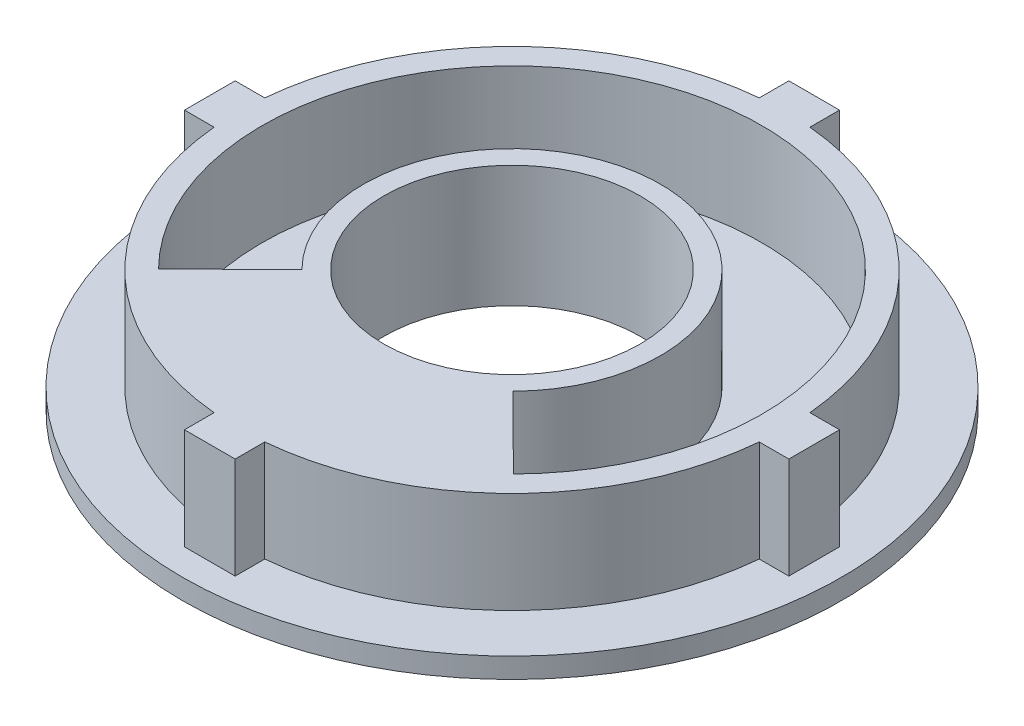
ISO-10303-21;
HEADER;
FILE_DESCRIPTION(('STEP AP214'),'2;1');
FILE_NAME('part.step','',(''),(''),'','','');
FILE_SCHEMA(('AUTOMOTIVE_DESIGN { 1 0 10303 214 1 1 1 1 }'));
ENDSEC;
DATA;
#1=APPLICATION_CONTEXT('core data for automotive mechanical design processes');
#2=APPLICATION_PROTOCOL_DEFINITION('international standard','automotive_design',2000,#1);
#3=PRODUCT_CONTEXT('',#1,'mechanical');
#4=PRODUCT('Part','Part','',(#3));
#5=PRODUCT_RELATED_PRODUCT_CATEGORY('part','',(#4));
#6=PRODUCT_DEFINITION_FORMATION('','',#4);
#7=PRODUCT_DEFINITION_CONTEXT('part definition',#1,'design');
#8=PRODUCT_DEFINITION('design','',#6,#7);
#9=PRODUCT_DEFINITION_SHAPE('','',#8);
#10=(LENGTH_UNIT() NAMED_UNIT(*) SI_UNIT(.MILLI.,.METRE.));
#11=(NAMED_UNIT(*) PLANE_ANGLE_UNIT() SI_UNIT($,.RADIAN.));
#12=(NAMED_UNIT(*) SI_UNIT($,.STERADIAN.) SOLID_ANGLE_UNIT());
#13=UNCERTAINTY_MEASURE_WITH_UNIT(LENGTH_MEASURE(1.E-05),#10,'distance_accuracy_value','');
#14=(GEOMETRIC_REPRESENTATION_CONTEXT(3) GLOBAL_UNCERTAINTY_ASSIGNED_CONTEXT((#13)) GLOBAL_UNIT_ASSIGNED_CONTEXT((#10,
#11,#12)) REPRESENTATION_CONTEXT('',''));
#15=CARTESIAN_POINT('',(0.,0.,0.));
#16=DIRECTION('',(0.,0.,1.));
#17=DIRECTION('',(1.,0.,0.));
#18=AXIS2_PLACEMENT_3D('',#15,#16,#17);
#19=CARTESIAN_POINT('',(0.,10.,0.));
#20=DIRECTION('',(0.,-1.,0.));
#21=DIRECTION('',(0.,0.,-1.));
#22=AXIS2_PLACEMENT_3D('',#19,#20,#21);
#23=CYLINDRICAL_SURFACE('',#22,27.);
#24=DIRECTION('',(0.,-1.,0.));
#25=VECTOR('',#24,1.);
#26=CARTESIAN_POINT('',(-26.8840101175404,10.,-2.49999999999735));
#27=LINE('',#26,#25);
#28=CARTESIAN_POINT('',(-26.8840101175404,10.,-2.49999999999735));
#29=VERTEX_POINT('',#28);
#30=CARTESIAN_POINT('',(-26.8840101175404,0.,-2.49999999999735));
#31=VERTEX_POINT('',#30);
#32=EDGE_CURVE('E203',#29,#31,#27,.T.);
#33=ORIENTED_EDGE('',*,*,#32,.F.);
#34=CARTESIAN_POINT('',(0.,10.,0.));
#35=DIRECTION('',(0.,1.,0.));
#36=DIRECTION('',(0.,0.,1.));
#37=AXIS2_PLACEMENT_3D('',#34,#35,#36);
#38=CIRCLE('',#37,27.);
#39=CARTESIAN_POINT('',(-2.5,10.,-26.8840101175401));
#40=VERTEX_POINT('',#39);
#41=EDGE_CURVE('E43',#40,#29,#38,.T.);
#42=ORIENTED_EDGE('',*,*,#41,.F.);
#43=DIRECTION('',(0.,-1.,0.));
#44=VECTOR('',#43,1.);
#45=CARTESIAN_POINT('',(-2.5,10.,-26.8840101175401));
#46=LINE('',#45,#44);
#47=CARTESIAN_POINT('',(-2.5,0.,-26.8840101175401));
#48=VERTEX_POINT('',#47);
#49=EDGE_CURVE('E279',#48,#40,#46,.F.);
#50=ORIENTED_EDGE('',*,*,#49,.F.);
#51=CARTESIAN_POINT('',(0.,0.,0.));
#52=DIRECTION('',(0.,1.,0.));
#53=DIRECTION('',(0.,0.,1.));
#54=AXIS2_PLACEMENT_3D('',#51,#52,#53);
#55=CIRCLE('',#54,27.);
#56=EDGE_CURVE('E310',#48,#31,#55,.T.);
#57=ORIENTED_EDGE('',*,*,#56,.T.);
#58=EDGE_LOOP('',(#33,#42,#50,#57));
#59=FACE_BOUND('',#58,.T.);
#60=ADVANCED_FACE('F36',(#59),#23,.T.);
#61=DIRECTION('',(0.,-1.,0.));
#62=VECTOR('',#61,1.);
#63=CARTESIAN_POINT('',(-26.8840101175399,10.,2.50000000000265));
#64=LINE('',#63,#62);
#65=CARTESIAN_POINT('',(-26.8840101175399,0.,2.50000000000265));
#66=VERTEX_POINT('',#65);
#67=CARTESIAN_POINT('',(-26.8840101175399,10.,2.50000000000265));
#68=VERTEX_POINT('',#67);
#69=EDGE_CURVE('E187',#66,#68,#64,.F.);
#70=ORIENTED_EDGE('',*,*,#69,.F.);
#71=CARTESIAN_POINT('',(-2.49999999999417,0.,26.8840101175407));
#72=VERTEX_POINT('',#71);
#73=EDGE_CURVE('E332',#66,#72,#55,.T.);
#74=ORIENTED_EDGE('',*,*,#73,.T.);
#75=DIRECTION('',(0.,-1.,0.));
#76=VECTOR('',#75,1.);
#77=CARTESIAN_POINT('',(-2.49999999999417,10.,26.8840101175407));
#78=LINE('',#77,#76);
#79=CARTESIAN_POINT('',(-2.49999999999417,10.,26.8840101175407));
#80=VERTEX_POINT('',#79);
#81=EDGE_CURVE('E230',#80,#72,#78,.T.);
#82=ORIENTED_EDGE('',*,*,#81,.F.);
#83=EDGE_CURVE('E330',#68,#80,#38,.T.);
#84=ORIENTED_EDGE('',*,*,#83,.F.);
#85=EDGE_LOOP('',(#70,#74,#82,#84));
#86=FACE_BOUND('',#85,.T.);
#87=ADVANCED_FACE('F368',(#86),#23,.T.);
#88=CARTESIAN_POINT('',(0.,0.,0.));
#89=DIRECTION('',(0.,-1.,0.));
#90=DIRECTION('',(0.,0.,-1.));
#91=AXIS2_PLACEMENT_3D('',#88,#89,#90);
#92=PLANE('',#91);
#93=CARTESIAN_POINT('',(0.,0.,0.));
#94=DIRECTION('',(0.,-1.,0.));
#95=DIRECTION('',(0.,0.,-1.));
#96=AXIS2_PLACEMENT_3D('',#93,#94,#95);
#97=CIRCLE('',#96,32.5);
#98=CARTESIAN_POINT('',(0.,0.,-32.5));
#99=VERTEX_POINT('',#98);
#100=EDGE_CURVE('E288',#99,#99,#97,.T.);
#101=ORIENTED_EDGE('',*,*,#100,.F.);
#102=EDGE_LOOP('',(#101));
#103=FACE_BOUND('',#102,.T.);
#104=DIRECTION('',(-1.,0.,0.));
#105=VECTOR('',#104,1.);
#106=CARTESIAN_POINT('',(-29.7999999999968,0.,-2.49999999999735));
#107=LINE('',#106,#105);
#108=CARTESIAN_POINT('',(-29.7999999999968,0.,-2.49999999999735));
#109=VERTEX_POINT('',#108);
#110=EDGE_CURVE('E185',#31,#109,#107,.T.);
#111=ORIENTED_EDGE('',*,*,#110,.F.);
#112=ORIENTED_EDGE('',*,*,#56,.F.);
#113=DIRECTION('',(0.,0.,1.));
#114=VECTOR('',#113,1.);
#115=CARTESIAN_POINT('',(-2.5,0.,-29.8));
#116=LINE('',#115,#114);
#117=CARTESIAN_POINT('',(-2.5,0.,-29.8));
#118=VERTEX_POINT('',#117);
#119=EDGE_CURVE('E265',#118,#48,#116,.T.);
#120=ORIENTED_EDGE('',*,*,#119,.F.);
#121=DIRECTION('',(-1.,0.,0.));
#122=VECTOR('',#121,1.);
#123=CARTESIAN_POINT('',(-2.5,0.,-29.8));
#124=LINE('',#123,#122);
#125=CARTESIAN_POINT('',(2.5,0.,-29.8));
#126=VERTEX_POINT('',#125);
#127=EDGE_CURVE('E261',#126,#118,#124,.T.);
#128=ORIENTED_EDGE('',*,*,#127,.F.);
#129=DIRECTION('',(0.,0.,-1.));
#130=VECTOR('',#129,1.);
#131=CARTESIAN_POINT('',(2.5,0.,0.));
#132=LINE('',#131,#130);
#133=CARTESIAN_POINT('',(2.5,0.,-26.8840101175401));
#134=VERTEX_POINT('',#133);
#135=EDGE_CURVE('E11',#134,#126,#132,.T.);
#136=ORIENTED_EDGE('',*,*,#135,.F.);
#137=CARTESIAN_POINT('',(26.8840101175398,0.,-2.50000000000318));
#138=VERTEX_POINT('',#137);
#139=EDGE_CURVE('E292',#138,#134,#55,.T.);
#140=ORIENTED_EDGE('',*,*,#139,.F.);
#141=DIRECTION('',(-1.,0.,0.));
#142=VECTOR('',#141,1.);
#143=CARTESIAN_POINT('',(29.8000000000026,0.,-2.50000000000318));
#144=LINE('',#143,#142);
#145=CARTESIAN_POINT('',(29.8000000000026,0.,-2.50000000000318));
#146=VERTEX_POINT('',#145);
#147=EDGE_CURVE('E237',#146,#138,#144,.T.);
#148=ORIENTED_EDGE('',*,*,#147,.F.);
#149=DIRECTION('',(0.,0.,-1.));
#150=VECTOR('',#149,1.);
#151=CARTESIAN_POINT('',(29.8000000000026,0.,-2.50000000000318));
#152=LINE('',#151,#150);
#153=CARTESIAN_POINT('',(29.8000000000026,0.,2.49999999999682));
#154=VERTEX_POINT('',#153);
#155=EDGE_CURVE('E245',#154,#146,#152,.T.);
#156=ORIENTED_EDGE('',*,*,#155,.F.);
#157=DIRECTION('',(1.,0.,0.));
#158=VECTOR('',#157,1.);
#159=CARTESIAN_POINT('',(29.8000000000026,0.,2.49999999999682));
#160=LINE('',#159,#158);
#161=CARTESIAN_POINT('',(26.8840101175404,0.,2.49999999999682));
#162=VERTEX_POINT('',#161);
#163=EDGE_CURVE('E233',#162,#154,#160,.T.);
#164=ORIENTED_EDGE('',*,*,#163,.F.);
#165=CARTESIAN_POINT('',(2.50000000000583,0.,26.8840101175396));
#166=VERTEX_POINT('',#165);
#167=EDGE_CURVE('E335',#166,#162,#55,.T.);
#168=ORIENTED_EDGE('',*,*,#167,.F.);
#169=DIRECTION('',(0.,0.,-1.));
#170=VECTOR('',#169,1.);
#171=CARTESIAN_POINT('',(2.50000000000583,0.,29.7999999999995));
#172=LINE('',#171,#170);
#173=CARTESIAN_POINT('',(2.50000000000583,0.,29.7999999999995));
#174=VERTEX_POINT('',#173);
#175=EDGE_CURVE('E209',#174,#166,#172,.T.);
#176=ORIENTED_EDGE('',*,*,#175,.F.);
#177=DIRECTION('',(1.,0.,0.));
#178=VECTOR('',#177,1.);
#179=CARTESIAN_POINT('',(2.50000000000583,0.,29.7999999999995));
#180=LINE('',#179,#178);
#181=CARTESIAN_POINT('',(-2.49999999999417,0.,29.7999999999995));
#182=VERTEX_POINT('',#181);
#183=EDGE_CURVE('E217',#182,#174,#180,.T.);
#184=ORIENTED_EDGE('',*,*,#183,.F.);
#185=DIRECTION('',(0.,0.,1.));
#186=VECTOR('',#185,1.);
#187=CARTESIAN_POINT('',(-2.49999999999417,0.,29.7999999999995));
#188=LINE('',#187,#186);
#189=EDGE_CURVE('E205',#72,#182,#188,.T.);
#190=ORIENTED_EDGE('',*,*,#189,.F.);
#191=ORIENTED_EDGE('',*,*,#73,.F.);
#192=DIRECTION('',(1.,0.,0.));
#193=VECTOR('',#192,1.);
#194=CARTESIAN_POINT('',(-29.7999999999968,0.,2.50000000000265));
#195=LINE('',#194,#193);
#196=CARTESIAN_POINT('',(-29.7999999999968,0.,2.50000000000265));
#197=VERTEX_POINT('',#196);
#198=EDGE_CURVE('E55',#197,#66,#195,.T.);
#199=ORIENTED_EDGE('',*,*,#198,.F.);
#200=DIRECTION('',(0.,0.,1.));
#201=VECTOR('',#200,1.);
#202=CARTESIAN_POINT('',(-29.7999999999968,0.,2.50000000000265));
#203=LINE('',#202,#201);
#204=EDGE_CURVE('E50',#109,#197,#203,.T.);
#205=ORIENTED_EDGE('',*,*,#204,.F.);
#206=EDGE_LOOP('',(#111,#112,#120,#128,#136,#140,#148,#156,#164,#168,#176,#184,#190,#191,#199,#205));
#207=FACE_BOUND('',#206,.T.);
#208=ADVANCED_FACE('F346',(#103,#207),#92,.F.);
#209=DIRECTION('',(0.,-1.,0.));
#210=VECTOR('',#209,1.);
#211=CARTESIAN_POINT('',(2.50000000000583,10.,26.8840101175396));
#212=LINE('',#211,#210);
#213=CARTESIAN_POINT('',(2.50000000000583,10.,26.8840101175396));
#214=VERTEX_POINT('',#213);
#215=EDGE_CURVE('E227',#166,#214,#212,.F.);
#216=ORIENTED_EDGE('',*,*,#215,.F.);
#217=ORIENTED_EDGE('',*,*,#167,.T.);
#218=DIRECTION('',(0.,-1.,0.));
#219=VECTOR('',#218,1.);
#220=CARTESIAN_POINT('',(26.8840101175404,10.,2.49999999999682));
#221=LINE('',#220,#219);
#222=CARTESIAN_POINT('',(26.8840101175404,10.,2.49999999999682));
#223=VERTEX_POINT('',#222);
#224=EDGE_CURVE('E258',#223,#162,#221,.T.);
#225=ORIENTED_EDGE('',*,*,#224,.F.);
#226=EDGE_CURVE('E352',#214,#223,#38,.T.);
#227=ORIENTED_EDGE('',*,*,#226,.F.);
#228=EDGE_LOOP('',(#216,#217,#225,#227));
#229=FACE_BOUND('',#228,.T.);
#230=ADVANCED_FACE('F344',(#229),#23,.T.);
#231=DIRECTION('',(0.,-1.,0.));
#232=VECTOR('',#231,1.);
#233=CARTESIAN_POINT('',(26.8840101175398,10.,-2.50000000000318));
#234=LINE('',#233,#232);
#235=CARTESIAN_POINT('',(26.8840101175398,10.,-2.50000000000318));
#236=VERTEX_POINT('',#235);
#237=EDGE_CURVE('E255',#138,#236,#234,.F.);
#238=ORIENTED_EDGE('',*,*,#237,.F.);
#239=ORIENTED_EDGE('',*,*,#139,.T.);
#240=DIRECTION('',(0.,-1.,0.));
#241=VECTOR('',#240,1.);
#242=CARTESIAN_POINT('',(2.5,10.,-26.8840101175401));
#243=LINE('',#242,#241);
#244=CARTESIAN_POINT('',(2.5,10.,-26.8840101175401));
#245=VERTEX_POINT('',#244);
#246=EDGE_CURVE('E282',#245,#134,#243,.T.);
#247=ORIENTED_EDGE('',*,*,#246,.F.);
#248=EDGE_CURVE('E329',#236,#245,#38,.T.);
#249=ORIENTED_EDGE('',*,*,#248,.F.);
#250=EDGE_LOOP('',(#238,#239,#247,#249));
#251=FACE_BOUND('',#250,.T.);
#252=ADVANCED_FACE('F357',(#251),#23,.T.);
#253=CARTESIAN_POINT('',(0.,10.,0.));
#254=DIRECTION('',(0.,1.,0.));
#255=DIRECTION('',(0.,0.,1.));
#256=AXIS2_PLACEMENT_3D('',#253,#254,#255);
#257=PLANE('',#256);
#258=ORIENTED_EDGE('',*,*,#41,.T.);
#259=DIRECTION('',(-1.,0.,0.));
#260=VECTOR('',#259,1.);
#261=CARTESIAN_POINT('',(-29.7999999999968,10.,-2.49999999999735));
#262=LINE('',#261,#260);
#263=CARTESIAN_POINT('',(-29.7999999999968,10.,-2.49999999999735));
#264=VERTEX_POINT('',#263);
#265=EDGE_CURVE('E170',#29,#264,#262,.T.);
#266=ORIENTED_EDGE('',*,*,#265,.T.);
#267=DIRECTION('',(0.,0.,1.));
#268=VECTOR('',#267,1.);
#269=CARTESIAN_POINT('',(-29.7999999999968,10.,2.50000000000265));
#270=LINE('',#269,#268);
#271=CARTESIAN_POINT('',(-29.7999999999968,10.,2.50000000000265));
#272=VERTEX_POINT('',#271);
#273=EDGE_CURVE('E176',#264,#272,#270,.T.);
#274=ORIENTED_EDGE('',*,*,#273,.T.);
#275=DIRECTION('',(1.,0.,0.));
#276=VECTOR('',#275,1.);
#277=CARTESIAN_POINT('',(-29.7999999999968,10.,2.50000000000265));
#278=LINE('',#277,#276);
#279=EDGE_CURVE('E193',#272,#68,#278,.T.);
#280=ORIENTED_EDGE('',*,*,#279,.T.);
#281=ORIENTED_EDGE('',*,*,#83,.T.);
#282=DIRECTION('',(0.,0.,1.));
#283=VECTOR('',#282,1.);
#284=CARTESIAN_POINT('',(-2.49999999999417,10.,29.7999999999995));
#285=LINE('',#284,#283);
#286=CARTESIAN_POINT('',(-2.49999999999417,10.,29.7999999999995));
#287=VERTEX_POINT('',#286);
#288=EDGE_CURVE('E206',#80,#287,#285,.T.);
#289=ORIENTED_EDGE('',*,*,#288,.T.);
#290=DIRECTION('',(1.,0.,0.));
#291=VECTOR('',#290,1.);
#292=CARTESIAN_POINT('',(2.50000000000583,10.,29.7999999999995));
#293=LINE('',#292,#291);
#294=CARTESIAN_POINT('',(2.50000000000583,10.,29.7999999999995));
#295=VERTEX_POINT('',#294);
#296=EDGE_CURVE('E208',#287,#295,#293,.T.);
#297=ORIENTED_EDGE('',*,*,#296,.T.);
#298=DIRECTION('',(0.,0.,-1.));
#299=VECTOR('',#298,1.);
#300=CARTESIAN_POINT('',(2.50000000000583,10.,29.7999999999995));
#301=LINE('',#300,#299);
#302=EDGE_CURVE('E211',#295,#214,#301,.T.);
#303=ORIENTED_EDGE('',*,*,#302,.T.);
#304=ORIENTED_EDGE('',*,*,#226,.T.);
#305=DIRECTION('',(1.,0.,0.));
#306=VECTOR('',#305,1.);
#307=CARTESIAN_POINT('',(29.8000000000026,10.,2.49999999999682));
#308=LINE('',#307,#306);
#309=CARTESIAN_POINT('',(29.8000000000026,10.,2.49999999999682));
#310=VERTEX_POINT('',#309);
#311=EDGE_CURVE('E234',#223,#310,#308,.T.);
#312=ORIENTED_EDGE('',*,*,#311,.T.);
#313=DIRECTION('',(0.,0.,-1.));
#314=VECTOR('',#313,1.);
#315=CARTESIAN_POINT('',(29.8000000000026,10.,-2.50000000000318));
#316=LINE('',#315,#314);
#317=CARTESIAN_POINT('',(29.8000000000026,10.,-2.50000000000318));
#318=VERTEX_POINT('',#317);
#319=EDGE_CURVE('E236',#310,#318,#316,.T.);
#320=ORIENTED_EDGE('',*,*,#319,.T.);
#321=DIRECTION('',(-1.,0.,0.));
#322=VECTOR('',#321,1.);
#323=CARTESIAN_POINT('',(29.8000000000026,10.,-2.50000000000318));
#324=LINE('',#323,#322);
#325=EDGE_CURVE('E239',#318,#236,#324,.T.);
#326=ORIENTED_EDGE('',*,*,#325,.T.);
#327=ORIENTED_EDGE('',*,*,#248,.T.);
#328=DIRECTION('',(0.,0.,-1.));
#329=VECTOR('',#328,1.);
#330=CARTESIAN_POINT('',(2.5,10.,-29.8));
#331=LINE('',#330,#329);
#332=CARTESIAN_POINT('',(2.5,10.,-29.8));
#333=VERTEX_POINT('',#332);
#334=EDGE_CURVE('E262',#245,#333,#331,.T.);
#335=ORIENTED_EDGE('',*,*,#334,.T.);
#336=DIRECTION('',(-1.,0.,0.));
#337=VECTOR('',#336,1.);
#338=CARTESIAN_POINT('',(-2.5,10.,-29.8));
#339=LINE('',#338,#337);
#340=CARTESIAN_POINT('',(-2.5,10.,-29.8));
#341=VERTEX_POINT('',#340);
#342=EDGE_CURVE('E264',#333,#341,#339,.T.);
#343=ORIENTED_EDGE('',*,*,#342,.T.);
#344=DIRECTION('',(0.,0.,1.));
#345=VECTOR('',#344,1.);
#346=CARTESIAN_POINT('',(-2.5,10.,-29.8));
#347=LINE('',#346,#345);
#348=EDGE_CURVE('E267',#341,#40,#347,.T.);
#349=ORIENTED_EDGE('',*,*,#348,.T.);
#350=EDGE_LOOP('',(#258,#266,#274,#280,#281,#289,#297,#303,#304,#312,#320,#326,#327,#335,#343,#349));
#351=FACE_BOUND('',#350,.T.);
#352=CARTESIAN_POINT('',(0.,10.,0.));
#353=DIRECTION('',(0.,1.,0.));
#354=DIRECTION('',(0.,0.,1.));
#355=AXIS2_PLACEMENT_3D('',#352,#353,#354);
#356=CIRCLE('',#355,12.65);
#357=CARTESIAN_POINT('',(0.,10.,12.65));
#358=VERTEX_POINT('',#357);
#359=EDGE_CURVE('E326',#358,#358,#356,.T.);
#360=ORIENTED_EDGE('',*,*,#359,.F.);
#361=EDGE_LOOP('',(#360));
#362=FACE_BOUND('',#361,.T.);
#363=DIRECTION('',(0.709939148073023,0.,-0.704263023332441));
#364=VECTOR('',#363,1.);
#365=CARTESIAN_POINT('',(-17.5,10.,17.3600835251447));
#366=LINE('',#365,#364);
#367=CARTESIAN_POINT('',(-17.5,10.,17.3600835251447));
#368=VERTEX_POINT('',#367);
#369=CARTESIAN_POINT('',(-10.4006085192698,10.,10.3174532918203));
#370=VERTEX_POINT('',#369);
#371=EDGE_CURVE('E297',#368,#370,#366,.T.);
#372=ORIENTED_EDGE('',*,*,#371,.F.);
#373=CARTESIAN_POINT('',(0.,10.,0.));
#374=DIRECTION('',(0.,1.,0.));
#375=DIRECTION('',(0.,0.,1.));
#376=AXIS2_PLACEMENT_3D('',#373,#374,#375);
#377=CIRCLE('',#376,24.65);
#378=CARTESIAN_POINT('',(17.5,10.,17.3600835251447));
#379=VERTEX_POINT('',#378);
#380=EDGE_CURVE('E295',#379,#368,#377,.T.);
#381=ORIENTED_EDGE('',*,*,#380,.F.);
#382=DIRECTION('',(0.709939148073023,0.,0.704263023332441));
#383=VECTOR('',#382,1.);
#384=CARTESIAN_POINT('',(17.5,10.,17.3600835251447));
#385=LINE('',#384,#383);
#386=CARTESIAN_POINT('',(10.4006085192698,10.,10.3174532918203));
#387=VERTEX_POINT('',#386);
#388=EDGE_CURVE('E303',#387,#379,#385,.T.);
#389=ORIENTED_EDGE('',*,*,#388,.F.);
#390=CARTESIAN_POINT('',(0.,10.,0.));
#391=DIRECTION('',(0.,-1.,0.));
#392=DIRECTION('',(0.,0.,1.));
#393=AXIS2_PLACEMENT_3D('',#390,#391,#392);
#394=CIRCLE('',#393,14.65);
#395=EDGE_CURVE('E300',#370,#387,#394,.T.);
#396=ORIENTED_EDGE('',*,*,#395,.F.);
#397=EDGE_LOOP('',(#372,#381,#389,#396));
#398=FACE_BOUND('',#397,.T.);
#399=ADVANCED_FACE('F172',(#351,#362,#398),#257,.T.);
#400=CARTESIAN_POINT('',(0.,10.,0.));
#401=DIRECTION('',(0.,-1.,0.));
#402=DIRECTION('',(0.,0.,-1.));
#403=AXIS2_PLACEMENT_3D('',#400,#401,#402);
#404=CYLINDRICAL_SURFACE('',#403,12.65);
#405=ORIENTED_EDGE('',*,*,#359,.T.);
#406=EDGE_LOOP('',(#405));
#407=FACE_BOUND('',#406,.T.);
#408=CARTESIAN_POINT('',(0.,-2.,0.));
#409=DIRECTION('',(0.,-1.,0.));
#410=DIRECTION('',(0.,0.,-1.));
#411=AXIS2_PLACEMENT_3D('',#408,#409,#410);
#412=CIRCLE('',#411,12.65);
#413=CARTESIAN_POINT('',(0.,-2.,-12.65));
#414=VERTEX_POINT('',#413);
#415=EDGE_CURVE('E285',#414,#414,#412,.T.);
#416=ORIENTED_EDGE('',*,*,#415,.T.);
#417=EDGE_LOOP('',(#416));
#418=FACE_BOUND('',#417,.T.);
#419=ADVANCED_FACE('F378',(#407,#418),#404,.F.);
#420=CARTESIAN_POINT('',(0.,10.,0.));
#421=DIRECTION('',(0.,-1.,0.));
#422=DIRECTION('',(0.,0.,-1.));
#423=AXIS2_PLACEMENT_3D('',#420,#421,#422);
#424=CYLINDRICAL_SURFACE('',#423,24.65);
#425=CARTESIAN_POINT('',(0.,0.,0.));
#426=DIRECTION('',(0.,1.,0.));
#427=DIRECTION('',(0.,0.,1.));
#428=AXIS2_PLACEMENT_3D('',#425,#426,#427);
#429=CIRCLE('',#428,24.65);
#430=CARTESIAN_POINT('',(17.5,0.,17.3600835251447));
#431=VERTEX_POINT('',#430);
#432=CARTESIAN_POINT('',(-17.5,0.,17.3600835251447));
#433=VERTEX_POINT('',#432);
#434=EDGE_CURVE('E306',#431,#433,#429,.T.);
#435=ORIENTED_EDGE('',*,*,#434,.F.);
#436=DIRECTION('',(0.,-1.,0.));
#437=VECTOR('',#436,1.);
#438=CARTESIAN_POINT('',(17.5,10.,17.3600835251447));
#439=LINE('',#438,#437);
#440=EDGE_CURVE('E305',#379,#431,#439,.T.);
#441=ORIENTED_EDGE('',*,*,#440,.F.);
#442=ORIENTED_EDGE('',*,*,#380,.T.);
#443=DIRECTION('',(0.,-1.,0.));
#444=VECTOR('',#443,1.);
#445=CARTESIAN_POINT('',(-17.5,10.,17.3600835251447));
#446=LINE('',#445,#444);
#447=EDGE_CURVE('E323',#368,#433,#446,.T.);
#448=ORIENTED_EDGE('',*,*,#447,.T.);
#449=EDGE_LOOP('',(#435,#441,#442,#448));
#450=FACE_BOUND('',#449,.T.);
#451=ADVANCED_FACE('F410',(#450),#424,.F.);
#452=CARTESIAN_POINT('',(-17.5,10.,17.3600835251447));
#453=DIRECTION('',(-0.704263023332441,0.,-0.709939148073023));
#454=DIRECTION('',(-0.709939148073023,0.,0.704263023332441));
#455=AXIS2_PLACEMENT_3D('',#452,#453,#454);
#456=PLANE('',#455);
#457=DIRECTION('',(0.709939148073023,0.,-0.704263023332441));
#458=VECTOR('',#457,1.);
#459=CARTESIAN_POINT('',(-17.5,0.,17.3600835251447));
#460=LINE('',#459,#458);
#461=CARTESIAN_POINT('',(-10.4006085192698,0.,10.3174532918203));
#462=VERTEX_POINT('',#461);
#463=EDGE_CURVE('E309',#433,#462,#460,.T.);
#464=ORIENTED_EDGE('',*,*,#463,.F.);
#465=ORIENTED_EDGE('',*,*,#447,.F.);
#466=ORIENTED_EDGE('',*,*,#371,.T.);
#467=DIRECTION('',(0.,-1.,0.));
#468=VECTOR('',#467,1.);
#469=CARTESIAN_POINT('',(-10.4006085192698,10.,10.3174532918203));
#470=LINE('',#469,#468);
#471=EDGE_CURVE('E321',#370,#462,#470,.T.);
#472=ORIENTED_EDGE('',*,*,#471,.T.);
#473=EDGE_LOOP('',(#464,#465,#466,#472));
#474=FACE_BOUND('',#473,.T.);
#475=ADVANCED_FACE('F414',(#474),#456,.T.);
#476=CARTESIAN_POINT('',(0.,10.,0.));
#477=DIRECTION('',(0.,-1.,0.));
#478=DIRECTION('',(0.,0.,-1.));
#479=AXIS2_PLACEMENT_3D('',#476,#477,#478);
#480=CYLINDRICAL_SURFACE('',#479,14.65);
#481=CARTESIAN_POINT('',(0.,0.,0.));
#482=DIRECTION('',(0.,-1.,0.));
#483=DIRECTION('',(0.,0.,1.));
#484=AXIS2_PLACEMENT_3D('',#481,#482,#483);
#485=CIRCLE('',#484,14.65);
#486=CARTESIAN_POINT('',(10.4006085192698,0.,10.3174532918203));
#487=VERTEX_POINT('',#486);
#488=EDGE_CURVE('E313',#462,#487,#485,.T.);
#489=ORIENTED_EDGE('',*,*,#488,.F.);
#490=ORIENTED_EDGE('',*,*,#471,.F.);
#491=ORIENTED_EDGE('',*,*,#395,.T.);
#492=DIRECTION('',(0.,-1.,0.));
#493=VECTOR('',#492,1.);
#494=CARTESIAN_POINT('',(10.4006085192698,10.,10.3174532918203));
#495=LINE('',#494,#493);
#496=EDGE_CURVE('E319',#387,#487,#495,.T.);
#497=ORIENTED_EDGE('',*,*,#496,.T.);
#498=EDGE_LOOP('',(#489,#490,#491,#497));
#499=FACE_BOUND('',#498,.T.);
#500=ADVANCED_FACE('F400',(#499),#480,.T.);
#501=CARTESIAN_POINT('',(17.5,10.,17.3600835251447));
#502=DIRECTION('',(0.704263023332441,0.,-0.709939148073023));
#503=DIRECTION('',(-0.709939148073023,0.,-0.704263023332441));
#504=AXIS2_PLACEMENT_3D('',#501,#502,#503);
#505=PLANE('',#504);
#506=DIRECTION('',(0.709939148073023,0.,0.704263023332441));
#507=VECTOR('',#506,1.);
#508=CARTESIAN_POINT('',(17.5,0.,17.3600835251447));
#509=LINE('',#508,#507);
#510=EDGE_CURVE('E298',#487,#431,#509,.T.);
#511=ORIENTED_EDGE('',*,*,#510,.F.);
#512=ORIENTED_EDGE('',*,*,#496,.F.);
#513=ORIENTED_EDGE('',*,*,#388,.T.);
#514=ORIENTED_EDGE('',*,*,#440,.T.);
#515=EDGE_LOOP('',(#511,#512,#513,#514));
#516=FACE_BOUND('',#515,.T.);
#517=ADVANCED_FACE('F392',(#516),#505,.T.);
#518=ORIENTED_EDGE('',*,*,#510,.T.);
#519=ORIENTED_EDGE('',*,*,#434,.T.);
#520=ORIENTED_EDGE('',*,*,#463,.T.);
#521=ORIENTED_EDGE('',*,*,#488,.T.);
#522=EDGE_LOOP('',(#518,#519,#520,#521));
#523=FACE_BOUND('',#522,.T.);
#524=ADVANCED_FACE('F384',(#523),#92,.F.);
#525=CARTESIAN_POINT('',(0.,-2.,0.));
#526=DIRECTION('',(0.,-1.,0.));
#527=DIRECTION('',(0.,0.,-1.));
#528=AXIS2_PLACEMENT_3D('',#525,#526,#527);
#529=PLANE('',#528);
#530=CARTESIAN_POINT('',(0.,-2.,0.));
#531=DIRECTION('',(0.,-1.,0.));
#532=DIRECTION('',(0.,0.,-1.));
#533=AXIS2_PLACEMENT_3D('',#530,#531,#532);
#534=CIRCLE('',#533,32.5);
#535=CARTESIAN_POINT('',(0.,-2.,-32.5));
#536=VERTEX_POINT('',#535);
#537=EDGE_CURVE('E289',#536,#536,#534,.T.);
#538=ORIENTED_EDGE('',*,*,#537,.T.);
#539=EDGE_LOOP('',(#538));
#540=FACE_BOUND('',#539,.T.);
#541=ORIENTED_EDGE('',*,*,#415,.F.);
#542=EDGE_LOOP('',(#541));
#543=FACE_BOUND('',#542,.T.);
#544=ADVANCED_FACE('F391',(#540,#543),#529,.T.);
#545=CARTESIAN_POINT('',(0.,-2.,0.));
#546=DIRECTION('',(0.,1.,0.));
#547=DIRECTION('',(0.,0.,1.));
#548=AXIS2_PLACEMENT_3D('',#545,#546,#547);
#549=CYLINDRICAL_SURFACE('',#548,32.5);
#550=ORIENTED_EDGE('',*,*,#537,.F.);
#551=EDGE_LOOP('',(#550));
#552=FACE_BOUND('',#551,.T.);
#553=ORIENTED_EDGE('',*,*,#100,.T.);
#554=EDGE_LOOP('',(#553));
#555=FACE_BOUND('',#554,.T.);
#556=ADVANCED_FACE('F398',(#552,#555),#549,.T.);
#557=CARTESIAN_POINT('',(2.5,10.,-29.8));
#558=DIRECTION('',(-1.,0.,0.));
#559=DIRECTION('',(0.,0.,1.));
#560=AXIS2_PLACEMENT_3D('',#557,#558,#559);
#561=PLANE('',#560);
#562=ORIENTED_EDGE('',*,*,#334,.F.);
#563=ORIENTED_EDGE('',*,*,#246,.T.);
#564=ORIENTED_EDGE('',*,*,#135,.T.);
#565=DIRECTION('',(0.,-1.,0.));
#566=VECTOR('',#565,1.);
#567=CARTESIAN_POINT('',(2.5,10.,-29.8));
#568=LINE('',#567,#566);
#569=EDGE_CURVE('E276',#333,#126,#568,.T.);
#570=ORIENTED_EDGE('',*,*,#569,.F.);
#571=EDGE_LOOP('',(#562,#563,#564,#570));
#572=FACE_BOUND('',#571,.T.);
#573=ADVANCED_FACE('F360',(#572),#561,.F.);
#574=CARTESIAN_POINT('',(-2.5,10.,-29.8));
#575=DIRECTION('',(1.,0.,0.));
#576=DIRECTION('',(0.,0.,-1.));
#577=AXIS2_PLACEMENT_3D('',#574,#575,#576);
#578=PLANE('',#577);
#579=ORIENTED_EDGE('',*,*,#119,.T.);
#580=ORIENTED_EDGE('',*,*,#49,.T.);
#581=ORIENTED_EDGE('',*,*,#348,.F.);
#582=DIRECTION('',(0.,-1.,0.));
#583=VECTOR('',#582,1.);
#584=CARTESIAN_POINT('',(-2.5,10.,-29.8));
#585=LINE('',#584,#583);
#586=EDGE_CURVE('E269',#341,#118,#585,.T.);
#587=ORIENTED_EDGE('',*,*,#586,.T.);
#588=EDGE_LOOP('',(#579,#580,#581,#587));
#589=FACE_BOUND('',#588,.T.);
#590=ADVANCED_FACE('F366',(#589),#578,.F.);
#591=CARTESIAN_POINT('',(-2.5,10.,-29.8));
#592=DIRECTION('',(0.,0.,1.));
#593=DIRECTION('',(1.,0.,0.));
#594=AXIS2_PLACEMENT_3D('',#591,#592,#593);
#595=PLANE('',#594);
#596=ORIENTED_EDGE('',*,*,#127,.T.);
#597=ORIENTED_EDGE('',*,*,#586,.F.);
#598=ORIENTED_EDGE('',*,*,#342,.F.);
#599=ORIENTED_EDGE('',*,*,#569,.T.);
#600=EDGE_LOOP('',(#596,#597,#598,#599));
#601=FACE_BOUND('',#600,.T.);
#602=ADVANCED_FACE('F362',(#601),#595,.F.);
#603=CARTESIAN_POINT('',(29.8000000000026,10.,2.49999999999682));
#604=DIRECTION('',(0.,0.,-1.));
#605=DIRECTION('',(-1.,0.,0.));
#606=AXIS2_PLACEMENT_3D('',#603,#604,#605);
#607=PLANE('',#606);
#608=ORIENTED_EDGE('',*,*,#311,.F.);
#609=ORIENTED_EDGE('',*,*,#224,.T.);
#610=ORIENTED_EDGE('',*,*,#163,.T.);
#611=DIRECTION('',(0.,-1.,0.));
#612=VECTOR('',#611,1.);
#613=CARTESIAN_POINT('',(29.8000000000026,10.,2.49999999999682));
#614=LINE('',#613,#612);
#615=EDGE_CURVE('E252',#310,#154,#614,.T.);
#616=ORIENTED_EDGE('',*,*,#615,.F.);
#617=EDGE_LOOP('',(#608,#609,#610,#616));
#618=FACE_BOUND('',#617,.T.);
#619=ADVANCED_FACE('F349',(#618),#607,.F.);
#620=CARTESIAN_POINT('',(29.8000000000026,10.,-2.50000000000318));
#621=DIRECTION('',(0.,0.,1.));
#622=DIRECTION('',(1.,0.,0.));
#623=AXIS2_PLACEMENT_3D('',#620,#621,#622);
#624=PLANE('',#623);
#625=ORIENTED_EDGE('',*,*,#147,.T.);
#626=ORIENTED_EDGE('',*,*,#237,.T.);
#627=ORIENTED_EDGE('',*,*,#325,.F.);
#628=DIRECTION('',(0.,-1.,0.));
#629=VECTOR('',#628,1.);
#630=CARTESIAN_POINT('',(29.8000000000026,10.,-2.50000000000318));
#631=LINE('',#630,#629);
#632=EDGE_CURVE('E242',#318,#146,#631,.T.);
#633=ORIENTED_EDGE('',*,*,#632,.T.);
#634=EDGE_LOOP('',(#625,#626,#627,#633));
#635=FACE_BOUND('',#634,.T.);
#636=ADVANCED_FACE('F535',(#635),#624,.F.);
#637=CARTESIAN_POINT('',(29.8000000000026,10.,-2.50000000000318));
#638=DIRECTION('',(-1.,0.,0.));
#639=DIRECTION('',(0.,0.,1.));
#640=AXIS2_PLACEMENT_3D('',#637,#638,#639);
#641=PLANE('',#640);
#642=ORIENTED_EDGE('',*,*,#155,.T.);
#643=ORIENTED_EDGE('',*,*,#632,.F.);
#644=ORIENTED_EDGE('',*,*,#319,.F.);
#645=ORIENTED_EDGE('',*,*,#615,.T.);
#646=EDGE_LOOP('',(#642,#643,#644,#645));
#647=FACE_BOUND('',#646,.T.);
#648=ADVANCED_FACE('F544',(#647),#641,.F.);
#649=CARTESIAN_POINT('',(-2.49999999999417,10.,29.7999999999995));
#650=DIRECTION('',(1.,0.,0.));
#651=DIRECTION('',(0.,0.,-1.));
#652=AXIS2_PLACEMENT_3D('',#649,#650,#651);
#653=PLANE('',#652);
#654=ORIENTED_EDGE('',*,*,#288,.F.);
#655=ORIENTED_EDGE('',*,*,#81,.T.);
#656=ORIENTED_EDGE('',*,*,#189,.T.);
#657=DIRECTION('',(0.,-1.,0.));
#658=VECTOR('',#657,1.);
#659=CARTESIAN_POINT('',(-2.49999999999417,10.,29.7999999999995));
#660=LINE('',#659,#658);
#661=EDGE_CURVE('E224',#287,#182,#660,.T.);
#662=ORIENTED_EDGE('',*,*,#661,.F.);
#663=EDGE_LOOP('',(#654,#655,#656,#662));
#664=FACE_BOUND('',#663,.T.);
#665=ADVANCED_FACE('F554',(#664),#653,.F.);
#666=CARTESIAN_POINT('',(2.50000000000583,10.,29.7999999999995));
#667=DIRECTION('',(-1.,0.,0.));
#668=DIRECTION('',(0.,0.,1.));
#669=AXIS2_PLACEMENT_3D('',#666,#667,#668);
#670=PLANE('',#669);
#671=ORIENTED_EDGE('',*,*,#175,.T.);
#672=ORIENTED_EDGE('',*,*,#215,.T.);
#673=ORIENTED_EDGE('',*,*,#302,.F.);
#674=DIRECTION('',(0.,-1.,0.));
#675=VECTOR('',#674,1.);
#676=CARTESIAN_POINT('',(2.50000000000583,10.,29.7999999999995));
#677=LINE('',#676,#675);
#678=EDGE_CURVE('E214',#295,#174,#677,.T.);
#679=ORIENTED_EDGE('',*,*,#678,.T.);
#680=EDGE_LOOP('',(#671,#672,#673,#679));
#681=FACE_BOUND('',#680,.T.);
#682=ADVANCED_FACE('F564',(#681),#670,.F.);
#683=CARTESIAN_POINT('',(2.50000000000583,10.,29.7999999999995));
#684=DIRECTION('',(0.,0.,-1.));
#685=DIRECTION('',(-1.,0.,0.));
#686=AXIS2_PLACEMENT_3D('',#683,#684,#685);
#687=PLANE('',#686);
#688=ORIENTED_EDGE('',*,*,#183,.T.);
#689=ORIENTED_EDGE('',*,*,#678,.F.);
#690=ORIENTED_EDGE('',*,*,#296,.F.);
#691=ORIENTED_EDGE('',*,*,#661,.T.);
#692=EDGE_LOOP('',(#688,#689,#690,#691));
#693=FACE_BOUND('',#692,.T.);
#694=ADVANCED_FACE('F574',(#693),#687,.F.);
#695=CARTESIAN_POINT('',(-29.7999999999968,10.,-2.49999999999735));
#696=DIRECTION('',(0.,0.,1.));
#697=DIRECTION('',(1.,0.,0.));
#698=AXIS2_PLACEMENT_3D('',#695,#696,#697);
#699=PLANE('',#698);
#700=ORIENTED_EDGE('',*,*,#265,.F.);
#701=ORIENTED_EDGE('',*,*,#32,.T.);
#702=ORIENTED_EDGE('',*,*,#110,.T.);
#703=DIRECTION('',(0.,-1.,0.));
#704=VECTOR('',#703,1.);
#705=CARTESIAN_POINT('',(-29.7999999999968,10.,-2.49999999999735));
#706=LINE('',#705,#704);
#707=EDGE_CURVE('E183',#264,#109,#706,.T.);
#708=ORIENTED_EDGE('',*,*,#707,.F.);
#709=EDGE_LOOP('',(#700,#701,#702,#708));
#710=FACE_BOUND('',#709,.T.);
#711=ADVANCED_FACE('F184',(#710),#699,.F.);
#712=CARTESIAN_POINT('',(-29.7999999999968,10.,2.50000000000265));
#713=DIRECTION('',(0.,0.,-1.));
#714=DIRECTION('',(-1.,0.,0.));
#715=AXIS2_PLACEMENT_3D('',#712,#713,#714);
#716=PLANE('',#715);
#717=ORIENTED_EDGE('',*,*,#198,.T.);
#718=ORIENTED_EDGE('',*,*,#69,.T.);
#719=ORIENTED_EDGE('',*,*,#279,.F.);
#720=DIRECTION('',(0.,-1.,0.));
#721=VECTOR('',#720,1.);
#722=CARTESIAN_POINT('',(-29.7999999999968,10.,2.50000000000265));
#723=LINE('',#722,#721);
#724=EDGE_CURVE('E188',#272,#197,#723,.T.);
#725=ORIENTED_EDGE('',*,*,#724,.T.);
#726=EDGE_LOOP('',(#717,#718,#719,#725));
#727=FACE_BOUND('',#726,.T.);
#728=ADVANCED_FACE('F593',(#727),#716,.F.);
#729=CARTESIAN_POINT('',(-29.7999999999968,10.,2.50000000000265));
#730=DIRECTION('',(1.,0.,0.));
#731=DIRECTION('',(0.,0.,-1.));
#732=AXIS2_PLACEMENT_3D('',#729,#730,#731);
#733=PLANE('',#732);
#734=ORIENTED_EDGE('',*,*,#204,.T.);
#735=ORIENTED_EDGE('',*,*,#724,.F.);
#736=ORIENTED_EDGE('',*,*,#273,.F.);
#737=ORIENTED_EDGE('',*,*,#707,.T.);
#738=EDGE_LOOP('',(#734,#735,#736,#737));
#739=FACE_BOUND('',#738,.T.);
#740=ADVANCED_FACE('F190',(#739),#733,.F.);
#741=CLOSED_SHELL('',(#60,#87,#208,#230,#252,#399,#419,#451,#475,#500,#517,#524,#544,#556,#573,
#590,#602,#619,#636,#648,#665,#682,#694,#711,#728,#740));
#742=MANIFOLD_SOLID_BREP('B2',#741);
#743=ADVANCED_BREP_SHAPE_REPRESENTATION('',(#18,#742),#14);
#744=SHAPE_DEFINITION_REPRESENTATION(#9,#743);
ENDSEC;
END-ISO-10303-21;
